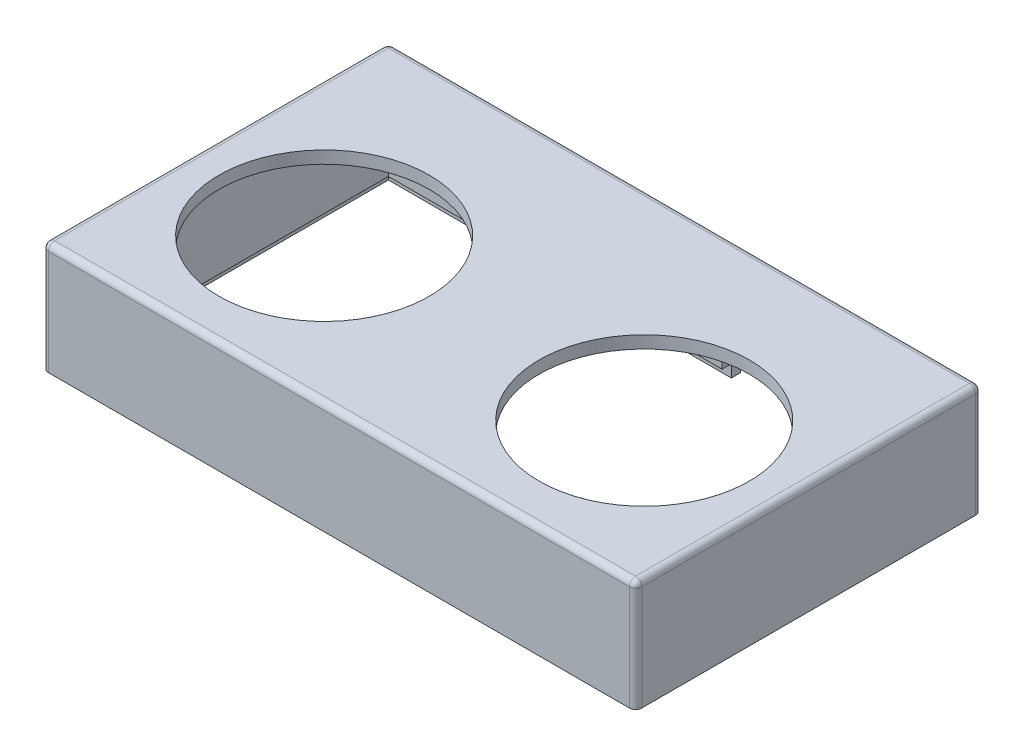
ISO-10303-21;
HEADER;
FILE_DESCRIPTION(('STEP AP214'),'2;1');
FILE_NAME('part.step','',(''),(''),'','','');
FILE_SCHEMA(('AUTOMOTIVE_DESIGN { 1 0 10303 214 1 1 1 1 }'));
ENDSEC;
DATA;
#1=APPLICATION_CONTEXT('core data for automotive mechanical design processes');
#2=APPLICATION_PROTOCOL_DEFINITION('international standard','automotive_design',2000,#1);
#3=PRODUCT_CONTEXT('',#1,'mechanical');
#4=PRODUCT('Part','Part','',(#3));
#5=PRODUCT_RELATED_PRODUCT_CATEGORY('part','',(#4));
#6=PRODUCT_DEFINITION_FORMATION('','',#4);
#7=PRODUCT_DEFINITION_CONTEXT('part definition',#1,'design');
#8=PRODUCT_DEFINITION('design','',#6,#7);
#9=PRODUCT_DEFINITION_SHAPE('','',#8);
#10=(LENGTH_UNIT() NAMED_UNIT(*) SI_UNIT(.MILLI.,.METRE.));
#11=(NAMED_UNIT(*) PLANE_ANGLE_UNIT() SI_UNIT($,.RADIAN.));
#12=(NAMED_UNIT(*) SI_UNIT($,.STERADIAN.) SOLID_ANGLE_UNIT());
#13=UNCERTAINTY_MEASURE_WITH_UNIT(LENGTH_MEASURE(1.E-05),#10,'distance_accuracy_value','');
#14=(GEOMETRIC_REPRESENTATION_CONTEXT(3) GLOBAL_UNCERTAINTY_ASSIGNED_CONTEXT((#13)) GLOBAL_UNIT_ASSIGNED_CONTEXT((#10,
#11,#12)) REPRESENTATION_CONTEXT('',''));
#15=CARTESIAN_POINT('',(0.,0.,0.));
#16=DIRECTION('',(0.,0.,1.));
#17=DIRECTION('',(1.,0.,0.));
#18=AXIS2_PLACEMENT_3D('',#15,#16,#17);
#19=CARTESIAN_POINT('',(-23.25,1.,-13.25));
#20=DIRECTION('',(0.,0.,-1.));
#21=DIRECTION('',(-1.,0.,0.));
#22=AXIS2_PLACEMENT_3D('',#19,#20,#21);
#23=PLANE('',#22);
#24=DIRECTION('',(1.,0.,0.));
#25=VECTOR('',#24,1.);
#26=CARTESIAN_POINT('',(-23.25,0.,-13.25));
#27=LINE('',#26,#25);
#28=CARTESIAN_POINT('',(-23.25,0.,-13.25));
#29=VERTEX_POINT('',#28);
#30=CARTESIAN_POINT('',(4.5,0.,-13.25));
#31=VERTEX_POINT('',#30);
#32=EDGE_CURVE('E710',#29,#31,#27,.T.);
#33=ORIENTED_EDGE('',*,*,#32,.T.);
#34=DIRECTION('',(0.,1.,0.));
#35=VECTOR('',#34,1.);
#36=CARTESIAN_POINT('',(4.5,1.,-13.25));
#37=LINE('',#36,#35);
#38=CARTESIAN_POINT('',(4.5,1.,-13.25));
#39=VERTEX_POINT('',#38);
#40=EDGE_CURVE('E204',#31,#39,#37,.T.);
#41=ORIENTED_EDGE('',*,*,#40,.T.);
#42=DIRECTION('',(1.,0.,0.));
#43=VECTOR('',#42,1.);
#44=CARTESIAN_POINT('',(-23.25,1.,-13.25));
#45=LINE('',#44,#43);
#46=CARTESIAN_POINT('',(-23.25,1.,-13.25));
#47=VERTEX_POINT('',#46);
#48=EDGE_CURVE('E717',#47,#39,#45,.T.);
#49=ORIENTED_EDGE('',*,*,#48,.F.);
#50=DIRECTION('',(0.,-1.,0.));
#51=VECTOR('',#50,1.);
#52=CARTESIAN_POINT('',(-23.25,1.,-13.25));
#53=LINE('',#52,#51);
#54=EDGE_CURVE('E734',#47,#29,#53,.T.);
#55=ORIENTED_EDGE('',*,*,#54,.T.);
#56=EDGE_LOOP('',(#33,#41,#49,#55));
#57=FACE_BOUND('',#56,.T.);
#58=ADVANCED_FACE('F37',(#57),#23,.F.);
#59=CARTESIAN_POINT('',(24.,9.,14.));
#60=DIRECTION('',(-1.,0.,0.));
#61=DIRECTION('',(0.,0.,1.));
#62=AXIS2_PLACEMENT_3D('',#59,#60,#61);
#63=PLANE('',#62);
#64=DIRECTION('',(0.,0.,-1.));
#65=VECTOR('',#64,1.);
#66=CARTESIAN_POINT('',(24.,0.,14.));
#67=LINE('',#66,#65);
#68=CARTESIAN_POINT('',(24.,0.,13.5));
#69=VERTEX_POINT('',#68);
#70=CARTESIAN_POINT('',(24.,0.,-13.5));
#71=VERTEX_POINT('',#70);
#72=EDGE_CURVE('E227',#69,#71,#67,.T.);
#73=ORIENTED_EDGE('',*,*,#72,.T.);
#74=DIRECTION('',(0.,-1.,0.));
#75=VECTOR('',#74,1.);
#76=CARTESIAN_POINT('',(24.,9.,-13.5));
#77=LINE('',#76,#75);
#78=CARTESIAN_POINT('',(24.,8.5,-13.5));
#79=VERTEX_POINT('',#78);
#80=EDGE_CURVE('E272',#71,#79,#77,.F.);
#81=ORIENTED_EDGE('',*,*,#80,.T.);
#82=DIRECTION('',(0.,0.,-1.));
#83=VECTOR('',#82,1.);
#84=CARTESIAN_POINT('',(24.,8.5,14.));
#85=LINE('',#84,#83);
#86=CARTESIAN_POINT('',(24.,8.5,13.5));
#87=VERTEX_POINT('',#86);
#88=EDGE_CURVE('E269',#79,#87,#85,.F.);
#89=ORIENTED_EDGE('',*,*,#88,.T.);
#90=DIRECTION('',(0.,-1.,0.));
#91=VECTOR('',#90,1.);
#92=CARTESIAN_POINT('',(24.,9.,13.5));
#93=LINE('',#92,#91);
#94=EDGE_CURVE('E267',#87,#69,#93,.T.);
#95=ORIENTED_EDGE('',*,*,#94,.T.);
#96=EDGE_LOOP('',(#73,#81,#89,#95));
#97=FACE_BOUND('',#96,.T.);
#98=ADVANCED_FACE('F385',(#97),#63,.F.);
#99=CARTESIAN_POINT('',(-24.,9.,-14.));
#100=DIRECTION('',(0.,0.,1.));
#101=DIRECTION('',(1.,0.,0.));
#102=AXIS2_PLACEMENT_3D('',#99,#100,#101);
#103=PLANE('',#102);
#104=DIRECTION('',(-1.,0.,0.));
#105=VECTOR('',#104,1.);
#106=CARTESIAN_POINT('',(-24.,8.5,-14.));
#107=LINE('',#106,#105);
#108=CARTESIAN_POINT('',(-23.5,8.5,-14.));
#109=VERTEX_POINT('',#108);
#110=CARTESIAN_POINT('',(23.5,8.5,-14.));
#111=VERTEX_POINT('',#110);
#112=EDGE_CURVE('E276',#109,#111,#107,.F.);
#113=ORIENTED_EDGE('',*,*,#112,.T.);
#114=DIRECTION('',(0.,-1.,0.));
#115=VECTOR('',#114,1.);
#116=CARTESIAN_POINT('',(23.5,9.,-14.));
#117=LINE('',#116,#115);
#118=CARTESIAN_POINT('',(23.5,0.,-14.));
#119=VERTEX_POINT('',#118);
#120=EDGE_CURVE('E278',#111,#119,#117,.T.);
#121=ORIENTED_EDGE('',*,*,#120,.T.);
#122=DIRECTION('',(-1.,0.,0.));
#123=VECTOR('',#122,1.);
#124=CARTESIAN_POINT('',(-24.,0.,-14.));
#125=LINE('',#124,#123);
#126=CARTESIAN_POINT('',(12.5,0.,-14.));
#127=VERTEX_POINT('',#126);
#128=EDGE_CURVE('E226',#119,#127,#125,.T.);
#129=ORIENTED_EDGE('',*,*,#128,.T.);
#130=DIRECTION('',(0.,1.,0.));
#131=VECTOR('',#130,1.);
#132=CARTESIAN_POINT('',(12.5,0.,-14.));
#133=LINE('',#132,#131);
#134=CARTESIAN_POINT('',(12.5,3.5,-14.));
#135=VERTEX_POINT('',#134);
#136=EDGE_CURVE('E219',#127,#135,#133,.T.);
#137=ORIENTED_EDGE('',*,*,#136,.T.);
#138=DIRECTION('',(-1.,0.,0.));
#139=VECTOR('',#138,1.);
#140=CARTESIAN_POINT('',(12.5,3.5,-14.));
#141=LINE('',#140,#139);
#142=CARTESIAN_POINT('',(4.5,3.5,-14.));
#143=VERTEX_POINT('',#142);
#144=EDGE_CURVE('E210',#135,#143,#141,.T.);
#145=ORIENTED_EDGE('',*,*,#144,.T.);
#146=DIRECTION('',(0.,-1.,0.));
#147=VECTOR('',#146,1.);
#148=CARTESIAN_POINT('',(4.5,0.,-14.));
#149=LINE('',#148,#147);
#150=CARTESIAN_POINT('',(4.5,0.,-14.));
#151=VERTEX_POINT('',#150);
#152=EDGE_CURVE('E201',#143,#151,#149,.T.);
#153=ORIENTED_EDGE('',*,*,#152,.T.);
#154=CARTESIAN_POINT('',(-23.5,0.,-14.));
#155=VERTEX_POINT('',#154);
#156=EDGE_CURVE('E215',#151,#155,#125,.T.);
#157=ORIENTED_EDGE('',*,*,#156,.T.);
#158=DIRECTION('',(0.,-1.,0.));
#159=VECTOR('',#158,1.);
#160=CARTESIAN_POINT('',(-23.5,9.,-14.));
#161=LINE('',#160,#159);
#162=EDGE_CURVE('E274',#155,#109,#161,.F.);
#163=ORIENTED_EDGE('',*,*,#162,.T.);
#164=EDGE_LOOP('',(#113,#121,#129,#137,#145,#153,#157,#163));
#165=FACE_BOUND('',#164,.T.);
#166=ADVANCED_FACE('F214',(#165),#103,.F.);
#167=CARTESIAN_POINT('',(-24.,9.,14.));
#168=DIRECTION('',(1.,0.,0.));
#169=DIRECTION('',(0.,0.,-1.));
#170=AXIS2_PLACEMENT_3D('',#167,#168,#169);
#171=PLANE('',#170);
#172=DIRECTION('',(0.,0.,1.));
#173=VECTOR('',#172,1.);
#174=CARTESIAN_POINT('',(-24.,8.5,14.));
#175=LINE('',#174,#173);
#176=CARTESIAN_POINT('',(-24.,8.5,13.5));
#177=VERTEX_POINT('',#176);
#178=CARTESIAN_POINT('',(-24.,8.5,-13.5));
#179=VERTEX_POINT('',#178);
#180=EDGE_CURVE('E46',#177,#179,#175,.F.);
#181=ORIENTED_EDGE('',*,*,#180,.T.);
#182=DIRECTION('',(0.,-1.,0.));
#183=VECTOR('',#182,1.);
#184=CARTESIAN_POINT('',(-24.,9.,-13.5));
#185=LINE('',#184,#183);
#186=CARTESIAN_POINT('',(-24.,0.,-13.5));
#187=VERTEX_POINT('',#186);
#188=EDGE_CURVE('E11',#179,#187,#185,.T.);
#189=ORIENTED_EDGE('',*,*,#188,.T.);
#190=DIRECTION('',(0.,0.,1.));
#191=VECTOR('',#190,1.);
#192=CARTESIAN_POINT('',(-24.,0.,14.));
#193=LINE('',#192,#191);
#194=CARTESIAN_POINT('',(-24.,0.,13.5));
#195=VERTEX_POINT('',#194);
#196=EDGE_CURVE('E229',#187,#195,#193,.T.);
#197=ORIENTED_EDGE('',*,*,#196,.T.);
#198=DIRECTION('',(0.,-1.,0.));
#199=VECTOR('',#198,1.);
#200=CARTESIAN_POINT('',(-24.,9.,13.5));
#201=LINE('',#200,#199);
#202=EDGE_CURVE('E57',#195,#177,#201,.F.);
#203=ORIENTED_EDGE('',*,*,#202,.T.);
#204=EDGE_LOOP('',(#181,#189,#197,#203));
#205=FACE_BOUND('',#204,.T.);
#206=ADVANCED_FACE('F355',(#205),#171,.F.);
#207=CARTESIAN_POINT('',(-24.,9.,14.));
#208=DIRECTION('',(0.,0.,-1.));
#209=DIRECTION('',(-1.,0.,0.));
#210=AXIS2_PLACEMENT_3D('',#207,#208,#209);
#211=PLANE('',#210);
#212=DIRECTION('',(1.,0.,0.));
#213=VECTOR('',#212,1.);
#214=CARTESIAN_POINT('',(-24.,0.,14.));
#215=LINE('',#214,#213);
#216=CARTESIAN_POINT('',(-23.5,0.,14.));
#217=VERTEX_POINT('',#216);
#218=CARTESIAN_POINT('',(23.5,0.,14.));
#219=VERTEX_POINT('',#218);
#220=EDGE_CURVE('E236',#217,#219,#215,.T.);
#221=ORIENTED_EDGE('',*,*,#220,.T.);
#222=DIRECTION('',(0.,-1.,0.));
#223=VECTOR('',#222,1.);
#224=CARTESIAN_POINT('',(23.5,9.,14.));
#225=LINE('',#224,#223);
#226=CARTESIAN_POINT('',(23.5,8.5,14.));
#227=VERTEX_POINT('',#226);
#228=EDGE_CURVE('E291',#219,#227,#225,.F.);
#229=ORIENTED_EDGE('',*,*,#228,.T.);
#230=DIRECTION('',(1.,0.,0.));
#231=VECTOR('',#230,1.);
#232=CARTESIAN_POINT('',(-24.,8.5,14.));
#233=LINE('',#232,#231);
#234=CARTESIAN_POINT('',(-23.5,8.5,14.));
#235=VERTEX_POINT('',#234);
#236=EDGE_CURVE('E287',#227,#235,#233,.F.);
#237=ORIENTED_EDGE('',*,*,#236,.T.);
#238=DIRECTION('',(0.,-1.,0.));
#239=VECTOR('',#238,1.);
#240=CARTESIAN_POINT('',(-23.5,9.,14.));
#241=LINE('',#240,#239);
#242=EDGE_CURVE('E289',#235,#217,#241,.T.);
#243=ORIENTED_EDGE('',*,*,#242,.T.);
#244=EDGE_LOOP('',(#221,#229,#237,#243));
#245=FACE_BOUND('',#244,.T.);
#246=ADVANCED_FACE('F359',(#245),#211,.F.);
#247=CARTESIAN_POINT('',(0.,9.,0.));
#248=DIRECTION('',(0.,-1.,0.));
#249=DIRECTION('',(0.,0.,-1.));
#250=AXIS2_PLACEMENT_3D('',#247,#248,#249);
#251=PLANE('',#250);
#252=DIRECTION('',(1.,0.,0.));
#253=VECTOR('',#252,1.);
#254=CARTESIAN_POINT('',(0.,9.,13.5));
#255=LINE('',#254,#253);
#256=CARTESIAN_POINT('',(-23.5,9.,13.5));
#257=VERTEX_POINT('',#256);
#258=CARTESIAN_POINT('',(23.5,9.,13.5));
#259=VERTEX_POINT('',#258);
#260=EDGE_CURVE('E258',#257,#259,#255,.T.);
#261=ORIENTED_EDGE('',*,*,#260,.T.);
#262=DIRECTION('',(0.,0.,-1.));
#263=VECTOR('',#262,1.);
#264=CARTESIAN_POINT('',(23.5,9.,0.));
#265=LINE('',#264,#263);
#266=CARTESIAN_POINT('',(23.5,9.,-13.5));
#267=VERTEX_POINT('',#266);
#268=EDGE_CURVE('E264',#259,#267,#265,.T.);
#269=ORIENTED_EDGE('',*,*,#268,.T.);
#270=DIRECTION('',(-1.,0.,0.));
#271=VECTOR('',#270,1.);
#272=CARTESIAN_POINT('',(0.,9.,-13.5));
#273=LINE('',#272,#271);
#274=CARTESIAN_POINT('',(-23.5,9.,-13.5));
#275=VERTEX_POINT('',#274);
#276=EDGE_CURVE('E262',#267,#275,#273,.T.);
#277=ORIENTED_EDGE('',*,*,#276,.T.);
#278=DIRECTION('',(0.,0.,1.));
#279=VECTOR('',#278,1.);
#280=CARTESIAN_POINT('',(-23.5,9.,0.));
#281=LINE('',#280,#279);
#282=EDGE_CURVE('E260',#275,#257,#281,.T.);
#283=ORIENTED_EDGE('',*,*,#282,.T.);
#284=EDGE_LOOP('',(#261,#269,#277,#283));
#285=FACE_BOUND('',#284,.T.);
#286=CARTESIAN_POINT('',(12.95,9.,2.25));
#287=DIRECTION('',(0.,1.,0.));
#288=DIRECTION('',(0.,0.,1.));
#289=AXIS2_PLACEMENT_3D('',#286,#287,#288);
#290=CIRCLE('',#289,8.5);
#291=CARTESIAN_POINT('',(12.95,9.,10.75));
#292=VERTEX_POINT('',#291);
#293=EDGE_CURVE('E248',#292,#292,#290,.T.);
#294=ORIENTED_EDGE('',*,*,#293,.F.);
#295=EDGE_LOOP('',(#294));
#296=FACE_BOUND('',#295,.T.);
#297=CARTESIAN_POINT('',(-12.95,9.,2.25));
#298=DIRECTION('',(0.,1.,0.));
#299=DIRECTION('',(0.,0.,1.));
#300=AXIS2_PLACEMENT_3D('',#297,#298,#299);
#301=CIRCLE('',#300,8.5);
#302=CARTESIAN_POINT('',(-12.95,9.,10.75));
#303=VERTEX_POINT('',#302);
#304=EDGE_CURVE('E244',#303,#303,#301,.T.);
#305=ORIENTED_EDGE('',*,*,#304,.F.);
#306=EDGE_LOOP('',(#305));
#307=FACE_BOUND('',#306,.T.);
#308=ADVANCED_FACE('F340',(#285,#296,#307),#251,.F.);
#309=CARTESIAN_POINT('',(0.,0.,0.));
#310=DIRECTION('',(0.,-1.,0.));
#311=DIRECTION('',(0.,0.,-1.));
#312=AXIS2_PLACEMENT_3D('',#309,#310,#311);
#313=PLANE('',#312);
#314=ORIENTED_EDGE('',*,*,#128,.F.);
#315=CARTESIAN_POINT('',(23.5,0.,-13.5));
#316=DIRECTION('',(0.,-1.,0.));
#317=DIRECTION('',(0.,0.,-1.));
#318=AXIS2_PLACEMENT_3D('',#315,#316,#317);
#319=CIRCLE('',#318,0.5);
#320=EDGE_CURVE('E285',#119,#71,#319,.T.);
#321=ORIENTED_EDGE('',*,*,#320,.T.);
#322=ORIENTED_EDGE('',*,*,#72,.F.);
#323=CARTESIAN_POINT('',(23.5,0.,13.5));
#324=DIRECTION('',(0.,-1.,0.));
#325=DIRECTION('',(0.,0.,-1.));
#326=AXIS2_PLACEMENT_3D('',#323,#324,#325);
#327=CIRCLE('',#326,0.5);
#328=EDGE_CURVE('E283',#69,#219,#327,.T.);
#329=ORIENTED_EDGE('',*,*,#328,.T.);
#330=ORIENTED_EDGE('',*,*,#220,.F.);
#331=CARTESIAN_POINT('',(-23.5,0.,13.5));
#332=DIRECTION('',(0.,-1.,0.));
#333=DIRECTION('',(0.,0.,-1.));
#334=AXIS2_PLACEMENT_3D('',#331,#332,#333);
#335=CIRCLE('',#334,0.5);
#336=EDGE_CURVE('E280',#217,#195,#335,.T.);
#337=ORIENTED_EDGE('',*,*,#336,.T.);
#338=ORIENTED_EDGE('',*,*,#196,.F.);
#339=CARTESIAN_POINT('',(-23.5,0.,-13.5));
#340=DIRECTION('',(0.,-1.,0.));
#341=DIRECTION('',(0.,0.,-1.));
#342=AXIS2_PLACEMENT_3D('',#339,#340,#341);
#343=CIRCLE('',#342,0.5);
#344=EDGE_CURVE('E225',#187,#155,#343,.T.);
#345=ORIENTED_EDGE('',*,*,#344,.T.);
#346=ORIENTED_EDGE('',*,*,#156,.F.);
#347=DIRECTION('',(0.,0.,1.));
#348=VECTOR('',#347,1.);
#349=CARTESIAN_POINT('',(4.5,0.,-14.));
#350=LINE('',#349,#348);
#351=EDGE_CURVE('E197',#151,#31,#350,.T.);
#352=ORIENTED_EDGE('',*,*,#351,.T.);
#353=ORIENTED_EDGE('',*,*,#32,.F.);
#354=DIRECTION('',(0.,0.,-1.));
#355=VECTOR('',#354,1.);
#356=CARTESIAN_POINT('',(-23.25,0.,-13.25));
#357=LINE('',#356,#355);
#358=CARTESIAN_POINT('',(-23.25,0.,13.25));
#359=VERTEX_POINT('',#358);
#360=EDGE_CURVE('E725',#359,#29,#357,.T.);
#361=ORIENTED_EDGE('',*,*,#360,.F.);
#362=DIRECTION('',(-1.,0.,0.));
#363=VECTOR('',#362,1.);
#364=CARTESIAN_POINT('',(-23.25,0.,13.25));
#365=LINE('',#364,#363);
#366=CARTESIAN_POINT('',(23.25,0.,13.25));
#367=VERTEX_POINT('',#366);
#368=EDGE_CURVE('E722',#367,#359,#365,.T.);
#369=ORIENTED_EDGE('',*,*,#368,.F.);
#370=DIRECTION('',(0.,0.,1.));
#371=VECTOR('',#370,1.);
#372=CARTESIAN_POINT('',(23.25,0.,-13.25));
#373=LINE('',#372,#371);
#374=CARTESIAN_POINT('',(23.25,0.,-13.25));
#375=VERTEX_POINT('',#374);
#376=EDGE_CURVE('E705',#375,#367,#373,.T.);
#377=ORIENTED_EDGE('',*,*,#376,.F.);
#378=CARTESIAN_POINT('',(12.5,0.,-13.25));
#379=VERTEX_POINT('',#378);
#380=EDGE_CURVE('E728',#379,#375,#27,.T.);
#381=ORIENTED_EDGE('',*,*,#380,.F.);
#382=DIRECTION('',(0.,0.,1.));
#383=VECTOR('',#382,1.);
#384=CARTESIAN_POINT('',(12.5,0.,-14.));
#385=LINE('',#384,#383);
#386=EDGE_CURVE('E209',#127,#379,#385,.T.);
#387=ORIENTED_EDGE('',*,*,#386,.F.);
#388=EDGE_LOOP('',(#314,#321,#322,#329,#330,#337,#338,#345,#346,#352,#353,#361,#369,#377,#381,#387));
#389=FACE_BOUND('',#388,.T.);
#390=ADVANCED_FACE('F222',(#389),#313,.T.);
#391=CARTESIAN_POINT('',(22.5,8.,-12.5));
#392=DIRECTION('',(1.,0.,0.));
#393=DIRECTION('',(0.,0.,-1.));
#394=AXIS2_PLACEMENT_3D('',#391,#392,#393);
#395=PLANE('',#394);
#396=DIRECTION('',(0.,-1.,0.));
#397=VECTOR('',#396,1.);
#398=CARTESIAN_POINT('',(22.5,8.,-12.5));
#399=LINE('',#398,#397);
#400=CARTESIAN_POINT('',(22.5,8.,-12.5));
#401=VERTEX_POINT('',#400);
#402=CARTESIAN_POINT('',(22.5,1.,-12.5));
#403=VERTEX_POINT('',#402);
#404=EDGE_CURVE('E231',#401,#403,#399,.T.);
#405=ORIENTED_EDGE('',*,*,#404,.T.);
#406=DIRECTION('',(0.,0.,1.));
#407=VECTOR('',#406,1.);
#408=CARTESIAN_POINT('',(22.5,1.,-12.5));
#409=LINE('',#408,#407);
#410=CARTESIAN_POINT('',(22.5,1.,12.5));
#411=VERTEX_POINT('',#410);
#412=EDGE_CURVE('E746',#403,#411,#409,.T.);
#413=ORIENTED_EDGE('',*,*,#412,.T.);
#414=DIRECTION('',(0.,-1.,0.));
#415=VECTOR('',#414,1.);
#416=CARTESIAN_POINT('',(22.5,8.,12.5));
#417=LINE('',#416,#415);
#418=CARTESIAN_POINT('',(22.5,8.,12.5));
#419=VERTEX_POINT('',#418);
#420=EDGE_CURVE('E764',#419,#411,#417,.T.);
#421=ORIENTED_EDGE('',*,*,#420,.F.);
#422=DIRECTION('',(0.,0.,1.));
#423=VECTOR('',#422,1.);
#424=CARTESIAN_POINT('',(22.5,8.,-12.5));
#425=LINE('',#424,#423);
#426=EDGE_CURVE('E243',#401,#419,#425,.T.);
#427=ORIENTED_EDGE('',*,*,#426,.F.);
#428=EDGE_LOOP('',(#405,#413,#421,#427));
#429=FACE_BOUND('',#428,.T.);
#430=ADVANCED_FACE('F469',(#429),#395,.F.);
#431=CARTESIAN_POINT('',(-22.5,8.,-12.5));
#432=DIRECTION('',(0.,0.,-1.));
#433=DIRECTION('',(-1.,0.,0.));
#434=AXIS2_PLACEMENT_3D('',#431,#432,#433);
#435=PLANE('',#434);
#436=DIRECTION('',(1.,0.,0.));
#437=VECTOR('',#436,1.);
#438=CARTESIAN_POINT('',(-22.5,1.,-12.5));
#439=LINE('',#438,#437);
#440=CARTESIAN_POINT('',(-22.5,1.,-12.5));
#441=VERTEX_POINT('',#440);
#442=CARTESIAN_POINT('',(4.5,1.,-12.5));
#443=VERTEX_POINT('',#442);
#444=EDGE_CURVE('E743',#441,#443,#439,.T.);
#445=ORIENTED_EDGE('',*,*,#444,.T.);
#446=DIRECTION('',(0.,1.,0.));
#447=VECTOR('',#446,1.);
#448=CARTESIAN_POINT('',(4.5,8.,-12.5));
#449=LINE('',#448,#447);
#450=CARTESIAN_POINT('',(4.5,3.5,-12.5));
#451=VERTEX_POINT('',#450);
#452=EDGE_CURVE('E703',#443,#451,#449,.T.);
#453=ORIENTED_EDGE('',*,*,#452,.T.);
#454=DIRECTION('',(1.,0.,0.));
#455=VECTOR('',#454,1.);
#456=CARTESIAN_POINT('',(-22.5,3.5,-12.5));
#457=LINE('',#456,#455);
#458=CARTESIAN_POINT('',(12.5,3.5,-12.5));
#459=VERTEX_POINT('',#458);
#460=EDGE_CURVE('E255',#451,#459,#457,.T.);
#461=ORIENTED_EDGE('',*,*,#460,.T.);
#462=DIRECTION('',(0.,-1.,0.));
#463=VECTOR('',#462,1.);
#464=CARTESIAN_POINT('',(12.5,8.,-12.5));
#465=LINE('',#464,#463);
#466=CARTESIAN_POINT('',(12.5,1.,-12.5));
#467=VERTEX_POINT('',#466);
#468=EDGE_CURVE('E691',#459,#467,#465,.T.);
#469=ORIENTED_EDGE('',*,*,#468,.T.);
#470=EDGE_CURVE('E742',#467,#403,#439,.T.);
#471=ORIENTED_EDGE('',*,*,#470,.T.);
#472=ORIENTED_EDGE('',*,*,#404,.F.);
#473=DIRECTION('',(1.,0.,0.));
#474=VECTOR('',#473,1.);
#475=CARTESIAN_POINT('',(-22.5,8.,-12.5));
#476=LINE('',#475,#474);
#477=CARTESIAN_POINT('',(-22.5,8.,-12.5));
#478=VERTEX_POINT('',#477);
#479=EDGE_CURVE('E761',#478,#401,#476,.T.);
#480=ORIENTED_EDGE('',*,*,#479,.F.);
#481=DIRECTION('',(0.,-1.,0.));
#482=VECTOR('',#481,1.);
#483=CARTESIAN_POINT('',(-22.5,8.,-12.5));
#484=LINE('',#483,#482);
#485=EDGE_CURVE('E767',#478,#441,#484,.T.);
#486=ORIENTED_EDGE('',*,*,#485,.T.);
#487=EDGE_LOOP('',(#445,#453,#461,#469,#471,#472,#480,#486));
#488=FACE_BOUND('',#487,.T.);
#489=ADVANCED_FACE('F465',(#488),#435,.F.);
#490=CARTESIAN_POINT('',(-22.5,8.,-12.5));
#491=DIRECTION('',(-1.,0.,0.));
#492=DIRECTION('',(0.,0.,1.));
#493=AXIS2_PLACEMENT_3D('',#490,#491,#492);
#494=PLANE('',#493);
#495=DIRECTION('',(0.,-1.,0.));
#496=VECTOR('',#495,1.);
#497=CARTESIAN_POINT('',(-22.5,8.,12.5));
#498=LINE('',#497,#496);
#499=CARTESIAN_POINT('',(-22.5,8.,12.5));
#500=VERTEX_POINT('',#499);
#501=CARTESIAN_POINT('',(-22.5,1.,12.5));
#502=VERTEX_POINT('',#501);
#503=EDGE_CURVE('E770',#500,#502,#498,.T.);
#504=ORIENTED_EDGE('',*,*,#503,.T.);
#505=DIRECTION('',(0.,0.,-1.));
#506=VECTOR('',#505,1.);
#507=CARTESIAN_POINT('',(-22.5,1.,-12.5));
#508=LINE('',#507,#506);
#509=EDGE_CURVE('E733',#502,#441,#508,.T.);
#510=ORIENTED_EDGE('',*,*,#509,.T.);
#511=ORIENTED_EDGE('',*,*,#485,.F.);
#512=DIRECTION('',(0.,0.,-1.));
#513=VECTOR('',#512,1.);
#514=CARTESIAN_POINT('',(-22.5,8.,-12.5));
#515=LINE('',#514,#513);
#516=EDGE_CURVE('E758',#500,#478,#515,.T.);
#517=ORIENTED_EDGE('',*,*,#516,.F.);
#518=EDGE_LOOP('',(#504,#510,#511,#517));
#519=FACE_BOUND('',#518,.T.);
#520=ADVANCED_FACE('F468',(#519),#494,.F.);
#521=CARTESIAN_POINT('',(-22.5,8.,12.5));
#522=DIRECTION('',(0.,0.,1.));
#523=DIRECTION('',(1.,0.,0.));
#524=AXIS2_PLACEMENT_3D('',#521,#522,#523);
#525=PLANE('',#524);
#526=ORIENTED_EDGE('',*,*,#420,.T.);
#527=DIRECTION('',(-1.,0.,0.));
#528=VECTOR('',#527,1.);
#529=CARTESIAN_POINT('',(-22.5,1.,12.5));
#530=LINE('',#529,#528);
#531=EDGE_CURVE('E239',#411,#502,#530,.T.);
#532=ORIENTED_EDGE('',*,*,#531,.T.);
#533=ORIENTED_EDGE('',*,*,#503,.F.);
#534=DIRECTION('',(-1.,0.,0.));
#535=VECTOR('',#534,1.);
#536=CARTESIAN_POINT('',(-22.5,8.,12.5));
#537=LINE('',#536,#535);
#538=EDGE_CURVE('E755',#419,#500,#537,.T.);
#539=ORIENTED_EDGE('',*,*,#538,.F.);
#540=EDGE_LOOP('',(#526,#532,#533,#539));
#541=FACE_BOUND('',#540,.T.);
#542=ADVANCED_FACE('F463',(#541),#525,.F.);
#543=CARTESIAN_POINT('',(0.,8.,0.));
#544=DIRECTION('',(0.,1.,0.));
#545=DIRECTION('',(0.,0.,1.));
#546=AXIS2_PLACEMENT_3D('',#543,#544,#545);
#547=PLANE('',#546);
#548=CARTESIAN_POINT('',(12.95,8.,2.25));
#549=DIRECTION('',(0.,1.,0.));
#550=DIRECTION('',(0.,0.,1.));
#551=AXIS2_PLACEMENT_3D('',#548,#549,#550);
#552=CIRCLE('',#551,8.5);
#553=CARTESIAN_POINT('',(12.95,8.,10.75));
#554=VERTEX_POINT('',#553);
#555=EDGE_CURVE('E245',#554,#554,#552,.T.);
#556=ORIENTED_EDGE('',*,*,#555,.T.);
#557=EDGE_LOOP('',(#556));
#558=FACE_BOUND('',#557,.T.);
#559=CARTESIAN_POINT('',(-12.95,8.,2.25));
#560=DIRECTION('',(0.,1.,0.));
#561=DIRECTION('',(0.,0.,1.));
#562=AXIS2_PLACEMENT_3D('',#559,#560,#561);
#563=CIRCLE('',#562,8.5);
#564=CARTESIAN_POINT('',(-12.95,8.,10.75));
#565=VERTEX_POINT('',#564);
#566=EDGE_CURVE('E240',#565,#565,#563,.T.);
#567=ORIENTED_EDGE('',*,*,#566,.T.);
#568=EDGE_LOOP('',(#567));
#569=FACE_BOUND('',#568,.T.);
#570=ORIENTED_EDGE('',*,*,#426,.T.);
#571=ORIENTED_EDGE('',*,*,#538,.T.);
#572=ORIENTED_EDGE('',*,*,#516,.T.);
#573=ORIENTED_EDGE('',*,*,#479,.T.);
#574=EDGE_LOOP('',(#570,#571,#572,#573));
#575=FACE_BOUND('',#574,.T.);
#576=ADVANCED_FACE('F459',(#558,#569,#575),#547,.F.);
#577=CARTESIAN_POINT('',(-12.95,-13.,2.25));
#578=DIRECTION('',(0.,1.,0.));
#579=DIRECTION('',(0.,0.,1.));
#580=AXIS2_PLACEMENT_3D('',#577,#578,#579);
#581=CYLINDRICAL_SURFACE('',#580,8.5);
#582=ORIENTED_EDGE('',*,*,#304,.T.);
#583=EDGE_LOOP('',(#582));
#584=FACE_BOUND('',#583,.T.);
#585=ORIENTED_EDGE('',*,*,#566,.F.);
#586=EDGE_LOOP('',(#585));
#587=FACE_BOUND('',#586,.T.);
#588=ADVANCED_FACE('F455',(#584,#587),#581,.F.);
#589=CARTESIAN_POINT('',(12.95,-13.,2.25));
#590=DIRECTION('',(0.,1.,0.));
#591=DIRECTION('',(0.,0.,1.));
#592=AXIS2_PLACEMENT_3D('',#589,#590,#591);
#593=CYLINDRICAL_SURFACE('',#592,8.5);
#594=ORIENTED_EDGE('',*,*,#293,.T.);
#595=EDGE_LOOP('',(#594));
#596=FACE_BOUND('',#595,.T.);
#597=ORIENTED_EDGE('',*,*,#555,.F.);
#598=EDGE_LOOP('',(#597));
#599=FACE_BOUND('',#598,.T.);
#600=ADVANCED_FACE('F437',(#596,#599),#593,.F.);
#601=CARTESIAN_POINT('',(0.,1.,0.));
#602=DIRECTION('',(0.,1.,0.));
#603=DIRECTION('',(0.,0.,1.));
#604=AXIS2_PLACEMENT_3D('',#601,#602,#603);
#605=PLANE('',#604);
#606=ORIENTED_EDGE('',*,*,#48,.T.);
#607=DIRECTION('',(0.,0.,1.));
#608=VECTOR('',#607,1.);
#609=CARTESIAN_POINT('',(4.5,1.,0.));
#610=LINE('',#609,#608);
#611=EDGE_CURVE('E700',#39,#443,#610,.T.);
#612=ORIENTED_EDGE('',*,*,#611,.T.);
#613=ORIENTED_EDGE('',*,*,#444,.F.);
#614=ORIENTED_EDGE('',*,*,#509,.F.);
#615=ORIENTED_EDGE('',*,*,#531,.F.);
#616=ORIENTED_EDGE('',*,*,#412,.F.);
#617=ORIENTED_EDGE('',*,*,#470,.F.);
#618=DIRECTION('',(0.,0.,-1.));
#619=VECTOR('',#618,1.);
#620=CARTESIAN_POINT('',(12.5,1.,0.));
#621=LINE('',#620,#619);
#622=CARTESIAN_POINT('',(12.5,1.,-13.25));
#623=VERTEX_POINT('',#622);
#624=EDGE_CURVE('E687',#467,#623,#621,.T.);
#625=ORIENTED_EDGE('',*,*,#624,.T.);
#626=CARTESIAN_POINT('',(23.25,1.,-13.25));
#627=VERTEX_POINT('',#626);
#628=EDGE_CURVE('E716',#623,#627,#45,.T.);
#629=ORIENTED_EDGE('',*,*,#628,.T.);
#630=DIRECTION('',(0.,0.,1.));
#631=VECTOR('',#630,1.);
#632=CARTESIAN_POINT('',(23.25,1.,-13.25));
#633=LINE('',#632,#631);
#634=CARTESIAN_POINT('',(23.25,1.,13.25));
#635=VERTEX_POINT('',#634);
#636=EDGE_CURVE('E706',#627,#635,#633,.T.);
#637=ORIENTED_EDGE('',*,*,#636,.T.);
#638=DIRECTION('',(-1.,0.,0.));
#639=VECTOR('',#638,1.);
#640=CARTESIAN_POINT('',(-23.25,1.,13.25));
#641=LINE('',#640,#639);
#642=CARTESIAN_POINT('',(-23.25,1.,13.25));
#643=VERTEX_POINT('',#642);
#644=EDGE_CURVE('E709',#635,#643,#641,.T.);
#645=ORIENTED_EDGE('',*,*,#644,.T.);
#646=DIRECTION('',(0.,0.,-1.));
#647=VECTOR('',#646,1.);
#648=CARTESIAN_POINT('',(-23.25,1.,-13.25));
#649=LINE('',#648,#647);
#650=EDGE_CURVE('E713',#643,#47,#649,.T.);
#651=ORIENTED_EDGE('',*,*,#650,.T.);
#652=EDGE_LOOP('',(#606,#612,#613,#614,#615,#616,#617,#625,#629,#637,#645,#651));
#653=FACE_BOUND('',#652,.T.);
#654=ADVANCED_FACE('F434',(#653),#605,.F.);
#655=CARTESIAN_POINT('',(23.25,1.,-13.25));
#656=DIRECTION('',(1.,0.,0.));
#657=DIRECTION('',(0.,0.,-1.));
#658=AXIS2_PLACEMENT_3D('',#655,#656,#657);
#659=PLANE('',#658);
#660=ORIENTED_EDGE('',*,*,#376,.T.);
#661=DIRECTION('',(0.,-1.,0.));
#662=VECTOR('',#661,1.);
#663=CARTESIAN_POINT('',(23.25,1.,13.25));
#664=LINE('',#663,#662);
#665=EDGE_CURVE('E720',#635,#367,#664,.T.);
#666=ORIENTED_EDGE('',*,*,#665,.F.);
#667=ORIENTED_EDGE('',*,*,#636,.F.);
#668=DIRECTION('',(0.,-1.,0.));
#669=VECTOR('',#668,1.);
#670=CARTESIAN_POINT('',(23.25,1.,-13.25));
#671=LINE('',#670,#669);
#672=EDGE_CURVE('E730',#627,#375,#671,.T.);
#673=ORIENTED_EDGE('',*,*,#672,.T.);
#674=EDGE_LOOP('',(#660,#666,#667,#673));
#675=FACE_BOUND('',#674,.T.);
#676=ADVANCED_FACE('F436',(#675),#659,.F.);
#677=ORIENTED_EDGE('',*,*,#628,.F.);
#678=DIRECTION('',(0.,-1.,0.));
#679=VECTOR('',#678,1.);
#680=CARTESIAN_POINT('',(12.5,1.,-13.25));
#681=LINE('',#680,#679);
#682=EDGE_CURVE('E251',#623,#379,#681,.T.);
#683=ORIENTED_EDGE('',*,*,#682,.T.);
#684=ORIENTED_EDGE('',*,*,#380,.T.);
#685=ORIENTED_EDGE('',*,*,#672,.F.);
#686=EDGE_LOOP('',(#677,#683,#684,#685));
#687=FACE_BOUND('',#686,.T.);
#688=ADVANCED_FACE('F395',(#687),#23,.F.);
#689=CARTESIAN_POINT('',(-23.25,1.,-13.25));
#690=DIRECTION('',(-1.,0.,0.));
#691=DIRECTION('',(0.,0.,1.));
#692=AXIS2_PLACEMENT_3D('',#689,#690,#691);
#693=PLANE('',#692);
#694=ORIENTED_EDGE('',*,*,#360,.T.);
#695=ORIENTED_EDGE('',*,*,#54,.F.);
#696=ORIENTED_EDGE('',*,*,#650,.F.);
#697=DIRECTION('',(0.,-1.,0.));
#698=VECTOR('',#697,1.);
#699=CARTESIAN_POINT('',(-23.25,1.,13.25));
#700=LINE('',#699,#698);
#701=EDGE_CURVE('E736',#643,#359,#700,.T.);
#702=ORIENTED_EDGE('',*,*,#701,.T.);
#703=EDGE_LOOP('',(#694,#695,#696,#702));
#704=FACE_BOUND('',#703,.T.);
#705=ADVANCED_FACE('F441',(#704),#693,.F.);
#706=CARTESIAN_POINT('',(-23.25,1.,13.25));
#707=DIRECTION('',(0.,0.,1.));
#708=DIRECTION('',(1.,0.,0.));
#709=AXIS2_PLACEMENT_3D('',#706,#707,#708);
#710=PLANE('',#709);
#711=ORIENTED_EDGE('',*,*,#368,.T.);
#712=ORIENTED_EDGE('',*,*,#701,.F.);
#713=ORIENTED_EDGE('',*,*,#644,.F.);
#714=ORIENTED_EDGE('',*,*,#665,.T.);
#715=EDGE_LOOP('',(#711,#712,#713,#714));
#716=FACE_BOUND('',#715,.T.);
#717=ADVANCED_FACE('F445',(#716),#710,.F.);
#718=CARTESIAN_POINT('',(12.5,3.5,-14.));
#719=DIRECTION('',(0.,1.,0.));
#720=DIRECTION('',(-1.,0.,0.));
#721=AXIS2_PLACEMENT_3D('',#718,#719,#720);
#722=PLANE('',#721);
#723=DIRECTION('',(0.,0.,1.));
#724=VECTOR('',#723,1.);
#725=CARTESIAN_POINT('',(4.5,3.5,-14.));
#726=LINE('',#725,#724);
#727=EDGE_CURVE('E684',#143,#451,#726,.T.);
#728=ORIENTED_EDGE('',*,*,#727,.F.);
#729=ORIENTED_EDGE('',*,*,#144,.F.);
#730=DIRECTION('',(0.,0.,1.));
#731=VECTOR('',#730,1.);
#732=CARTESIAN_POINT('',(12.5,3.5,-14.));
#733=LINE('',#732,#731);
#734=EDGE_CURVE('E688',#135,#459,#733,.T.);
#735=ORIENTED_EDGE('',*,*,#734,.T.);
#736=ORIENTED_EDGE('',*,*,#460,.F.);
#737=EDGE_LOOP('',(#728,#729,#735,#736));
#738=FACE_BOUND('',#737,.T.);
#739=ADVANCED_FACE('F430',(#738),#722,.F.);
#740=CARTESIAN_POINT('',(4.5,0.,-14.));
#741=DIRECTION('',(-1.,0.,0.));
#742=DIRECTION('',(0.,0.,1.));
#743=AXIS2_PLACEMENT_3D('',#740,#741,#742);
#744=PLANE('',#743);
#745=ORIENTED_EDGE('',*,*,#611,.F.);
#746=ORIENTED_EDGE('',*,*,#40,.F.);
#747=ORIENTED_EDGE('',*,*,#351,.F.);
#748=ORIENTED_EDGE('',*,*,#152,.F.);
#749=ORIENTED_EDGE('',*,*,#727,.T.);
#750=ORIENTED_EDGE('',*,*,#452,.F.);
#751=EDGE_LOOP('',(#745,#746,#747,#748,#749,#750));
#752=FACE_BOUND('',#751,.T.);
#753=ADVANCED_FACE('F199',(#752),#744,.F.);
#754=CARTESIAN_POINT('',(12.5,0.,-14.));
#755=DIRECTION('',(1.,0.,0.));
#756=DIRECTION('',(0.,0.,-1.));
#757=AXIS2_PLACEMENT_3D('',#754,#755,#756);
#758=PLANE('',#757);
#759=ORIENTED_EDGE('',*,*,#734,.F.);
#760=ORIENTED_EDGE('',*,*,#136,.F.);
#761=ORIENTED_EDGE('',*,*,#386,.T.);
#762=ORIENTED_EDGE('',*,*,#682,.F.);
#763=ORIENTED_EDGE('',*,*,#624,.F.);
#764=ORIENTED_EDGE('',*,*,#468,.F.);
#765=EDGE_LOOP('',(#759,#760,#761,#762,#763,#764));
#766=FACE_BOUND('',#765,.T.);
#767=ADVANCED_FACE('F421',(#766),#758,.F.);
#768=CARTESIAN_POINT('',(-23.5,9.,13.5));
#769=DIRECTION('',(0.,-1.,0.));
#770=DIRECTION('',(0.,0.,-1.));
#771=AXIS2_PLACEMENT_3D('',#768,#769,#770);
#772=CYLINDRICAL_SURFACE('',#771,0.5);
#773=ORIENTED_EDGE('',*,*,#336,.F.);
#774=ORIENTED_EDGE('',*,*,#242,.F.);
#775=CARTESIAN_POINT('',(-23.5,8.5,13.5));
#776=DIRECTION('',(0.,1.,0.));
#777=DIRECTION('',(0.,0.,1.));
#778=AXIS2_PLACEMENT_3D('',#775,#776,#777);
#779=CIRCLE('',#778,0.5);
#780=EDGE_CURVE('E41',#177,#235,#779,.T.);
#781=ORIENTED_EDGE('',*,*,#780,.F.);
#782=ORIENTED_EDGE('',*,*,#202,.F.);
#783=EDGE_LOOP('',(#773,#774,#781,#782));
#784=FACE_BOUND('',#783,.T.);
#785=ADVANCED_FACE('F39',(#784),#772,.T.);
#786=CARTESIAN_POINT('',(-23.5,8.5,0.));
#787=DIRECTION('',(0.,0.,1.));
#788=DIRECTION('',(1.,0.,0.));
#789=AXIS2_PLACEMENT_3D('',#786,#787,#788);
#790=CYLINDRICAL_SURFACE('',#789,0.5);
#791=CARTESIAN_POINT('',(-23.5,8.5,-13.5));
#792=DIRECTION('',(0.,0.,-1.));
#793=DIRECTION('',(-1.,0.,0.));
#794=AXIS2_PLACEMENT_3D('',#791,#792,#793);
#795=CIRCLE('',#794,0.5);
#796=EDGE_CURVE('E320',#179,#275,#795,.T.);
#797=ORIENTED_EDGE('',*,*,#796,.F.);
#798=ORIENTED_EDGE('',*,*,#180,.F.);
#799=CARTESIAN_POINT('',(-23.5,8.5,13.5));
#800=DIRECTION('',(0.,0.,1.));
#801=DIRECTION('',(1.,0.,0.));
#802=AXIS2_PLACEMENT_3D('',#799,#800,#801);
#803=CIRCLE('',#802,0.5);
#804=EDGE_CURVE('E322',#257,#177,#803,.T.);
#805=ORIENTED_EDGE('',*,*,#804,.F.);
#806=ORIENTED_EDGE('',*,*,#282,.F.);
#807=EDGE_LOOP('',(#797,#798,#805,#806));
#808=FACE_BOUND('',#807,.T.);
#809=ADVANCED_FACE('F347',(#808),#790,.T.);
#810=CARTESIAN_POINT('',(-23.5,9.,-13.5));
#811=DIRECTION('',(0.,-1.,0.));
#812=DIRECTION('',(0.,0.,-1.));
#813=AXIS2_PLACEMENT_3D('',#810,#811,#812);
#814=CYLINDRICAL_SURFACE('',#813,0.5);
#815=ORIENTED_EDGE('',*,*,#344,.F.);
#816=ORIENTED_EDGE('',*,*,#188,.F.);
#817=CARTESIAN_POINT('',(-23.5,8.5,-13.5));
#818=DIRECTION('',(0.,1.,0.));
#819=DIRECTION('',(0.,0.,1.));
#820=AXIS2_PLACEMENT_3D('',#817,#818,#819);
#821=CIRCLE('',#820,0.5);
#822=EDGE_CURVE('E317',#109,#179,#821,.T.);
#823=ORIENTED_EDGE('',*,*,#822,.F.);
#824=ORIENTED_EDGE('',*,*,#162,.F.);
#825=EDGE_LOOP('',(#815,#816,#823,#824));
#826=FACE_BOUND('',#825,.T.);
#827=ADVANCED_FACE('F354',(#826),#814,.T.);
#828=CARTESIAN_POINT('',(-23.5,8.5,13.5));
#829=DIRECTION('',(0.,0.,1.));
#830=DIRECTION('',(1.,0.,0.));
#831=AXIS2_PLACEMENT_3D('',#828,#829,#830);
#832=SPHERICAL_SURFACE('',#831,0.5);
#833=ORIENTED_EDGE('',*,*,#804,.T.);
#834=ORIENTED_EDGE('',*,*,#780,.T.);
#835=CARTESIAN_POINT('',(-23.5,8.5,13.5));
#836=DIRECTION('',(-1.,0.,0.));
#837=DIRECTION('',(0.,0.,1.));
#838=AXIS2_PLACEMENT_3D('',#835,#836,#837);
#839=CIRCLE('',#838,0.5);
#840=EDGE_CURVE('E314',#257,#235,#839,.F.);
#841=ORIENTED_EDGE('',*,*,#840,.F.);
#842=EDGE_LOOP('',(#833,#834,#841));
#843=FACE_BOUND('',#842,.T.);
#844=ADVANCED_FACE('F329',(#843),#832,.T.);
#845=CARTESIAN_POINT('',(-23.5,8.5,-13.5));
#846=DIRECTION('',(0.,0.,1.));
#847=DIRECTION('',(1.,0.,0.));
#848=AXIS2_PLACEMENT_3D('',#845,#846,#847);
#849=SPHERICAL_SURFACE('',#848,0.5);
#850=ORIENTED_EDGE('',*,*,#822,.T.);
#851=ORIENTED_EDGE('',*,*,#796,.T.);
#852=CARTESIAN_POINT('',(-23.5,8.5,-13.5));
#853=DIRECTION('',(-1.,0.,0.));
#854=DIRECTION('',(0.,0.,1.));
#855=AXIS2_PLACEMENT_3D('',#852,#853,#854);
#856=CIRCLE('',#855,0.5);
#857=EDGE_CURVE('E311',#109,#275,#856,.F.);
#858=ORIENTED_EDGE('',*,*,#857,.F.);
#859=EDGE_LOOP('',(#850,#851,#858));
#860=FACE_BOUND('',#859,.T.);
#861=ADVANCED_FACE('F351',(#860),#849,.T.);
#862=CARTESIAN_POINT('',(23.5,9.,13.5));
#863=DIRECTION('',(0.,-1.,0.));
#864=DIRECTION('',(0.,0.,-1.));
#865=AXIS2_PLACEMENT_3D('',#862,#863,#864);
#866=CYLINDRICAL_SURFACE('',#865,0.5);
#867=ORIENTED_EDGE('',*,*,#328,.F.);
#868=ORIENTED_EDGE('',*,*,#94,.F.);
#869=CARTESIAN_POINT('',(23.5,8.5,13.5));
#870=DIRECTION('',(0.,1.,0.));
#871=DIRECTION('',(0.,0.,1.));
#872=AXIS2_PLACEMENT_3D('',#869,#870,#871);
#873=CIRCLE('',#872,0.5);
#874=EDGE_CURVE('E308',#227,#87,#873,.T.);
#875=ORIENTED_EDGE('',*,*,#874,.F.);
#876=ORIENTED_EDGE('',*,*,#228,.F.);
#877=EDGE_LOOP('',(#867,#868,#875,#876));
#878=FACE_BOUND('',#877,.T.);
#879=ADVANCED_FACE('F363',(#878),#866,.T.);
#880=CARTESIAN_POINT('',(0.,8.5,13.5));
#881=DIRECTION('',(1.,0.,0.));
#882=DIRECTION('',(0.,0.,-1.));
#883=AXIS2_PLACEMENT_3D('',#880,#881,#882);
#884=CYLINDRICAL_SURFACE('',#883,0.5);
#885=ORIENTED_EDGE('',*,*,#840,.T.);
#886=ORIENTED_EDGE('',*,*,#236,.F.);
#887=CARTESIAN_POINT('',(23.5,8.5,13.5));
#888=DIRECTION('',(1.,0.,0.));
#889=DIRECTION('',(0.,0.,-1.));
#890=AXIS2_PLACEMENT_3D('',#887,#888,#889);
#891=CIRCLE('',#890,0.5);
#892=EDGE_CURVE('E305',#259,#227,#891,.T.);
#893=ORIENTED_EDGE('',*,*,#892,.F.);
#894=ORIENTED_EDGE('',*,*,#260,.F.);
#895=EDGE_LOOP('',(#885,#886,#893,#894));
#896=FACE_BOUND('',#895,.T.);
#897=ADVANCED_FACE('F335',(#896),#884,.T.);
#898=CARTESIAN_POINT('',(0.,8.5,-13.5));
#899=DIRECTION('',(-1.,0.,0.));
#900=DIRECTION('',(0.,0.,1.));
#901=AXIS2_PLACEMENT_3D('',#898,#899,#900);
#902=CYLINDRICAL_SURFACE('',#901,0.5);
#903=ORIENTED_EDGE('',*,*,#857,.T.);
#904=ORIENTED_EDGE('',*,*,#276,.F.);
#905=CARTESIAN_POINT('',(23.5,8.5,-13.5));
#906=DIRECTION('',(1.,0.,0.));
#907=DIRECTION('',(0.,0.,-1.));
#908=AXIS2_PLACEMENT_3D('',#905,#906,#907);
#909=CIRCLE('',#908,0.5);
#910=EDGE_CURVE('E302',#111,#267,#909,.T.);
#911=ORIENTED_EDGE('',*,*,#910,.F.);
#912=ORIENTED_EDGE('',*,*,#112,.F.);
#913=EDGE_LOOP('',(#903,#904,#911,#912));
#914=FACE_BOUND('',#913,.T.);
#915=ADVANCED_FACE('F376',(#914),#902,.T.);
#916=CARTESIAN_POINT('',(23.5,9.,-13.5));
#917=DIRECTION('',(0.,-1.,0.));
#918=DIRECTION('',(0.,0.,-1.));
#919=AXIS2_PLACEMENT_3D('',#916,#917,#918);
#920=CYLINDRICAL_SURFACE('',#919,0.5);
#921=ORIENTED_EDGE('',*,*,#320,.F.);
#922=ORIENTED_EDGE('',*,*,#120,.F.);
#923=CARTESIAN_POINT('',(23.5,8.5,-13.5));
#924=DIRECTION('',(0.,1.,0.));
#925=DIRECTION('',(0.,0.,1.));
#926=AXIS2_PLACEMENT_3D('',#923,#924,#925);
#927=CIRCLE('',#926,0.5);
#928=EDGE_CURVE('E299',#79,#111,#927,.T.);
#929=ORIENTED_EDGE('',*,*,#928,.F.);
#930=ORIENTED_EDGE('',*,*,#80,.F.);
#931=EDGE_LOOP('',(#921,#922,#929,#930));
#932=FACE_BOUND('',#931,.T.);
#933=ADVANCED_FACE('F380',(#932),#920,.T.);
#934=CARTESIAN_POINT('',(23.5,8.5,13.5));
#935=DIRECTION('',(0.,0.,1.));
#936=DIRECTION('',(1.,0.,0.));
#937=AXIS2_PLACEMENT_3D('',#934,#935,#936);
#938=SPHERICAL_SURFACE('',#937,0.5);
#939=ORIENTED_EDGE('',*,*,#892,.T.);
#940=ORIENTED_EDGE('',*,*,#874,.T.);
#941=CARTESIAN_POINT('',(23.5,8.5,13.5));
#942=DIRECTION('',(0.,0.,1.));
#943=DIRECTION('',(1.,0.,0.));
#944=AXIS2_PLACEMENT_3D('',#941,#942,#943);
#945=CIRCLE('',#944,0.5);
#946=EDGE_CURVE('E297',#259,#87,#945,.F.);
#947=ORIENTED_EDGE('',*,*,#946,.F.);
#948=EDGE_LOOP('',(#939,#940,#947));
#949=FACE_BOUND('',#948,.T.);
#950=ADVANCED_FACE('F366',(#949),#938,.T.);
#951=CARTESIAN_POINT('',(23.5,8.5,-13.5));
#952=DIRECTION('',(0.,0.,1.));
#953=DIRECTION('',(1.,0.,0.));
#954=AXIS2_PLACEMENT_3D('',#951,#952,#953);
#955=SPHERICAL_SURFACE('',#954,0.5);
#956=ORIENTED_EDGE('',*,*,#928,.T.);
#957=ORIENTED_EDGE('',*,*,#910,.T.);
#958=CARTESIAN_POINT('',(23.5,8.5,-13.5));
#959=DIRECTION('',(0.,0.,-1.));
#960=DIRECTION('',(-1.,0.,0.));
#961=AXIS2_PLACEMENT_3D('',#958,#959,#960);
#962=CIRCLE('',#961,0.5);
#963=EDGE_CURVE('E295',#79,#267,#962,.F.);
#964=ORIENTED_EDGE('',*,*,#963,.F.);
#965=EDGE_LOOP('',(#956,#957,#964));
#966=FACE_BOUND('',#965,.T.);
#967=ADVANCED_FACE('F373',(#966),#955,.T.);
#968=CARTESIAN_POINT('',(23.5,8.5,0.));
#969=DIRECTION('',(0.,0.,-1.));
#970=DIRECTION('',(-1.,0.,0.));
#971=AXIS2_PLACEMENT_3D('',#968,#969,#970);
#972=CYLINDRICAL_SURFACE('',#971,0.5);
#973=ORIENTED_EDGE('',*,*,#946,.T.);
#974=ORIENTED_EDGE('',*,*,#88,.F.);
#975=ORIENTED_EDGE('',*,*,#963,.T.);
#976=ORIENTED_EDGE('',*,*,#268,.F.);
#977=EDGE_LOOP('',(#973,#974,#975,#976));
#978=FACE_BOUND('',#977,.T.);
#979=ADVANCED_FACE('F369',(#978),#972,.T.);
#980=CLOSED_SHELL('',(#58,#98,#166,#206,#246,#308,#390,#430,#489,#520,#542,#576,#588,#600,#654,
#676,#688,#705,#717,#739,#753,#767,#785,#809,#827,#844,#861,#879,#897,#915,#933,#950,#967,#979));
#981=MANIFOLD_SOLID_BREP('B2',#980);
#982=ADVANCED_BREP_SHAPE_REPRESENTATION('',(#18,#981),#14);
#983=SHAPE_DEFINITION_REPRESENTATION(#9,#982);
ENDSEC;
END-ISO-10303-21;
